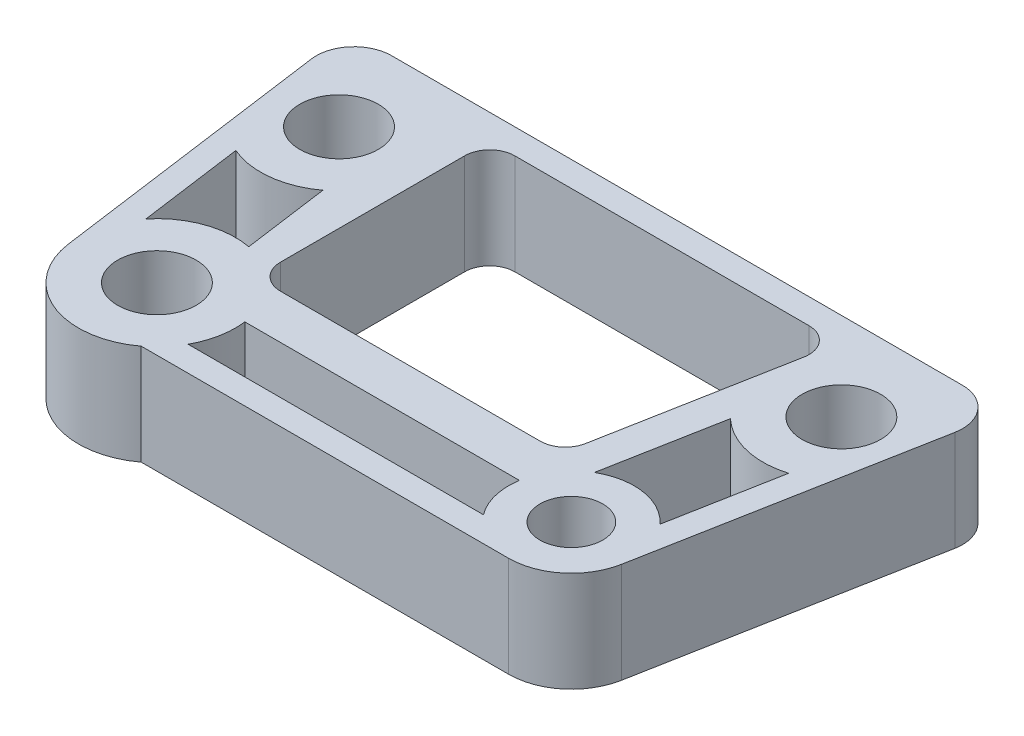
ISO-10303-21;
HEADER;
FILE_DESCRIPTION(('STEP AP214'),'2;1');
FILE_NAME('part.step','',(''),(''),'','','');
FILE_SCHEMA(('AUTOMOTIVE_DESIGN { 1 0 10303 214 1 1 1 1 }'));
ENDSEC;
DATA;
#1=APPLICATION_CONTEXT('core data for automotive mechanical design processes');
#2=APPLICATION_PROTOCOL_DEFINITION('international standard','automotive_design',2000,#1);
#3=PRODUCT_CONTEXT('',#1,'mechanical');
#4=PRODUCT('Part','Part','',(#3));
#5=PRODUCT_RELATED_PRODUCT_CATEGORY('part','',(#4));
#6=PRODUCT_DEFINITION_FORMATION('','',#4);
#7=PRODUCT_DEFINITION_CONTEXT('part definition',#1,'design');
#8=PRODUCT_DEFINITION('design','',#6,#7);
#9=PRODUCT_DEFINITION_SHAPE('','',#8);
#10=(LENGTH_UNIT() NAMED_UNIT(*) SI_UNIT(.MILLI.,.METRE.));
#11=(NAMED_UNIT(*) PLANE_ANGLE_UNIT() SI_UNIT($,.RADIAN.));
#12=(NAMED_UNIT(*) SI_UNIT($,.STERADIAN.) SOLID_ANGLE_UNIT());
#13=UNCERTAINTY_MEASURE_WITH_UNIT(LENGTH_MEASURE(1.E-05),#10,'distance_accuracy_value','');
#14=(GEOMETRIC_REPRESENTATION_CONTEXT(3) GLOBAL_UNCERTAINTY_ASSIGNED_CONTEXT((#13)) GLOBAL_UNIT_ASSIGNED_CONTEXT((#10,
#11,#12)) REPRESENTATION_CONTEXT('',''));
#15=CARTESIAN_POINT('',(0.,0.,0.));
#16=DIRECTION('',(0.,0.,1.));
#17=DIRECTION('',(1.,0.,0.));
#18=AXIS2_PLACEMENT_3D('',#15,#16,#17);
#19=CARTESIAN_POINT('',(0.,10.16,0.));
#20=DIRECTION('',(0.,1.,0.));
#21=DIRECTION('',(0.,0.,1.));
#22=AXIS2_PLACEMENT_3D('',#19,#20,#21);
#23=PLANE('',#22);
#24=DIRECTION('',(-1.,0.,0.));
#25=VECTOR('',#24,1.);
#26=CARTESIAN_POINT('',(36.7304782039458,10.16,-29.21));
#27=LINE('',#26,#25);
#28=CARTESIAN_POINT('',(36.7304782039458,10.16,-29.21));
#29=VERTEX_POINT('',#28);
#30=CARTESIAN_POINT('',(6.98499999999999,10.16,-29.21));
#31=VERTEX_POINT('',#30);
#32=EDGE_CURVE('E347',#29,#31,#27,.T.);
#33=ORIENTED_EDGE('',*,*,#32,.F.);
#34=CARTESIAN_POINT('',(36.7304782039458,10.16,-26.67));
#35=DIRECTION('',(0.,1.,0.));
#36=DIRECTION('',(0.,0.,-1.));
#37=AXIS2_PLACEMENT_3D('',#34,#35,#36);
#38=CIRCLE('',#37,2.54000000000001);
#39=CARTESIAN_POINT('',(39.2274023090102,10.16,-26.2041995990249));
#40=VERTEX_POINT('',#39);
#41=EDGE_CURVE('E345',#40,#29,#38,.T.);
#42=ORIENTED_EDGE('',*,*,#41,.F.);
#43=DIRECTION('',(0.183385984635866,0.,-0.983040986245809));
#44=VECTOR('',#43,1.);
#45=CARTESIAN_POINT('',(35.7526035417728,10.16,-7.5775329323582));
#46=LINE('',#45,#44);
#47=CARTESIAN_POINT('',(35.7526035417728,10.16,-7.5775329323582));
#48=VERTEX_POINT('',#47);
#49=EDGE_CURVE('E361',#48,#40,#46,.T.);
#50=ORIENTED_EDGE('',*,*,#49,.F.);
#51=CARTESIAN_POINT('',(33.2556794367085,10.16,-8.04333333333329));
#52=DIRECTION('',(0.,1.,0.));
#53=DIRECTION('',(0.,0.,1.));
#54=AXIS2_PLACEMENT_3D('',#51,#52,#53);
#55=CIRCLE('',#54,2.54);
#56=CARTESIAN_POINT('',(33.2556794367085,10.16,-5.50333333333329));
#57=VERTEX_POINT('',#56);
#58=EDGE_CURVE('E358',#57,#48,#55,.T.);
#59=ORIENTED_EDGE('',*,*,#58,.F.);
#60=DIRECTION('',(1.,0.,0.));
#61=VECTOR('',#60,1.);
#62=CARTESIAN_POINT('',(33.2556794367085,10.16,-5.50333333333329));
#63=LINE('',#62,#61);
#64=CARTESIAN_POINT('',(6.98499999999999,10.16,-5.50333333333328));
#65=VERTEX_POINT('',#64);
#66=EDGE_CURVE('E356',#65,#57,#63,.T.);
#67=ORIENTED_EDGE('',*,*,#66,.F.);
#68=CARTESIAN_POINT('',(6.98499999999999,10.16,-8.04333333333328));
#69=DIRECTION('',(0.,1.,0.));
#70=DIRECTION('',(0.,0.,1.));
#71=AXIS2_PLACEMENT_3D('',#68,#69,#70);
#72=CIRCLE('',#71,2.54);
#73=CARTESIAN_POINT('',(4.445,10.16,-8.04333333333328));
#74=VERTEX_POINT('',#73);
#75=EDGE_CURVE('E354',#74,#65,#72,.T.);
#76=ORIENTED_EDGE('',*,*,#75,.F.);
#77=DIRECTION('',(0.,0.,1.));
#78=VECTOR('',#77,1.);
#79=CARTESIAN_POINT('',(4.44499999999999,10.16,-26.6699999999999));
#80=LINE('',#79,#78);
#81=CARTESIAN_POINT('',(4.44499999999999,10.16,-26.6699999999999));
#82=VERTEX_POINT('',#81);
#83=EDGE_CURVE('E352',#82,#74,#80,.T.);
#84=ORIENTED_EDGE('',*,*,#83,.F.);
#85=CARTESIAN_POINT('',(6.98499999999999,10.16,-26.6699999999999));
#86=DIRECTION('',(0.,1.,0.));
#87=DIRECTION('',(0.,0.,-1.));
#88=AXIS2_PLACEMENT_3D('',#85,#86,#87);
#89=CIRCLE('',#88,2.54);
#90=EDGE_CURVE('E350',#31,#82,#89,.T.);
#91=ORIENTED_EDGE('',*,*,#90,.F.);
#92=EDGE_LOOP('',(#33,#42,#50,#59,#67,#76,#84,#91));
#93=FACE_BOUND('',#92,.T.);
#94=CARTESIAN_POINT('',(-4.445,10.16,-22.86));
#95=DIRECTION('',(0.,1.,0.));
#96=DIRECTION('',(0.,0.,1.));
#97=AXIS2_PLACEMENT_3D('',#94,#95,#96);
#98=CIRCLE('',#97,3.96875);
#99=CARTESIAN_POINT('',(-4.445,10.16,-18.89125));
#100=VERTEX_POINT('',#99);
#101=EDGE_CURVE('E404',#100,#100,#98,.T.);
#102=ORIENTED_EDGE('',*,*,#101,.F.);
#103=EDGE_LOOP('',(#102));
#104=FACE_BOUND('',#103,.T.);
#105=CARTESIAN_POINT('',(0.,10.16,0.));
#106=DIRECTION('',(0.,1.,0.));
#107=DIRECTION('',(0.,0.,1.));
#108=AXIS2_PLACEMENT_3D('',#105,#106,#107);
#109=CIRCLE('',#108,3.96875);
#110=CARTESIAN_POINT('',(0.,10.16,3.96875));
#111=VERTEX_POINT('',#110);
#112=EDGE_CURVE('E416',#111,#111,#109,.T.);
#113=ORIENTED_EDGE('',*,*,#112,.F.);
#114=EDGE_LOOP('',(#113));
#115=FACE_BOUND('',#114,.T.);
#116=DIRECTION('',(0.183385984635865,0.,-0.98304098624581));
#117=VECTOR('',#116,1.);
#118=CARTESIAN_POINT('',(48.1523102626609,10.16,1.16450100243773));
#119=LINE('',#118,#117);
#120=CARTESIAN_POINT('',(48.1523102626609,10.16,1.16450100243773));
#121=VERTEX_POINT('',#120);
#122=CARTESIAN_POINT('',(53.4514033307907,10.16,-27.2412993985373));
#123=VERTEX_POINT('',#122);
#124=EDGE_CURVE('E431',#121,#123,#119,.T.);
#125=ORIENTED_EDGE('',*,*,#124,.T.);
#126=CARTESIAN_POINT('',(49.7060171731942,10.16,-27.94));
#127=DIRECTION('',(0.,1.,0.));
#128=DIRECTION('',(0.,0.,1.));
#129=AXIS2_PLACEMENT_3D('',#126,#127,#128);
#130=CIRCLE('',#129,3.81);
#131=CARTESIAN_POINT('',(49.7060171731942,10.16,-31.75));
#132=VERTEX_POINT('',#131);
#133=EDGE_CURVE('E55',#123,#132,#130,.T.);
#134=ORIENTED_EDGE('',*,*,#133,.T.);
#135=DIRECTION('',(-1.,0.,0.));
#136=VECTOR('',#135,1.);
#137=CARTESIAN_POINT('',(54.2925,10.16,-31.75));
#138=LINE('',#137,#136);
#139=CARTESIAN_POINT('',(-8.01215852056534,10.16,-31.75));
#140=VERTEX_POINT('',#139);
#141=EDGE_CURVE('E433',#132,#140,#138,.T.);
#142=ORIENTED_EDGE('',*,*,#141,.T.);
#143=CARTESIAN_POINT('',(-8.01215852056534,10.16,-27.94));
#144=DIRECTION('',(0.,1.,0.));
#145=DIRECTION('',(0.,0.,1.));
#146=AXIS2_PLACEMENT_3D('',#143,#144,#145);
#147=CIRCLE('',#146,3.81);
#148=CARTESIAN_POINT('',(-11.786572069123,10.16,-27.4204787160625));
#149=VERTEX_POINT('',#148);
#150=EDGE_CURVE('E62',#140,#149,#147,.T.);
#151=ORIENTED_EDGE('',*,*,#150,.T.);
#152=DIRECTION('',(0.136357292372048,0.,0.990659724030892));
#153=VECTOR('',#152,1.);
#154=CARTESIAN_POINT('',(-12.3825,10.16,-31.75));
#155=LINE('',#154,#153);
#156=CARTESIAN_POINT('',(-7.86336155949521,10.16,1.08233600820313));
#157=VERTEX_POINT('',#156);
#158=EDGE_CURVE('E422',#149,#157,#155,.T.);
#159=ORIENTED_EDGE('',*,*,#158,.T.);
#160=CARTESIAN_POINT('',(0.,10.16,0.));
#161=DIRECTION('',(0.,1.,0.));
#162=DIRECTION('',(0.,0.,1.));
#163=AXIS2_PLACEMENT_3D('',#160,#161,#162);
#164=CIRCLE('',#163,7.9375);
#165=CARTESIAN_POINT('',(4.76250000000001,10.16,6.34999999999999));
#166=VERTEX_POINT('',#165);
#167=EDGE_CURVE('E424',#157,#166,#164,.T.);
#168=ORIENTED_EDGE('',*,*,#167,.T.);
#169=DIRECTION('',(1.,0.,0.));
#170=VECTOR('',#169,1.);
#171=CARTESIAN_POINT('',(41.91,10.16,6.34999999999999));
#172=LINE('',#171,#170);
#173=CARTESIAN_POINT('',(41.91,10.16,6.35));
#174=VERTEX_POINT('',#173);
#175=EDGE_CURVE('E427',#166,#174,#172,.T.);
#176=ORIENTED_EDGE('',*,*,#175,.T.);
#177=CARTESIAN_POINT('',(41.91,10.16,0.));
#178=DIRECTION('',(0.,1.,0.));
#179=DIRECTION('',(0.,0.,1.));
#180=AXIS2_PLACEMENT_3D('',#177,#178,#179);
#181=CIRCLE('',#180,6.35);
#182=EDGE_CURVE('E429',#174,#121,#181,.T.);
#183=ORIENTED_EDGE('',*,*,#182,.T.);
#184=EDGE_LOOP('',(#125,#134,#142,#151,#159,#168,#176,#183));
#185=FACE_BOUND('',#184,.T.);
#186=CARTESIAN_POINT('',(46.355,10.16,-22.86));
#187=DIRECTION('',(0.,1.,0.));
#188=DIRECTION('',(0.,0.,1.));
#189=AXIS2_PLACEMENT_3D('',#186,#187,#188);
#190=CIRCLE('',#189,3.96874999999998);
#191=CARTESIAN_POINT('',(46.355,10.16,-18.8912500000001));
#192=VERTEX_POINT('',#191);
#193=EDGE_CURVE('E410',#192,#192,#190,.T.);
#194=ORIENTED_EDGE('',*,*,#193,.F.);
#195=EDGE_LOOP('',(#194));
#196=FACE_BOUND('',#195,.T.);
#197=CARTESIAN_POINT('',(41.91,10.16,0.));
#198=DIRECTION('',(0.,1.,0.));
#199=DIRECTION('',(0.,0.,1.));
#200=AXIS2_PLACEMENT_3D('',#197,#198,#199);
#201=CIRCLE('',#200,3.175);
#202=CARTESIAN_POINT('',(41.91,10.16,3.175));
#203=VERTEX_POINT('',#202);
#204=EDGE_CURVE('E339',#203,#203,#201,.T.);
#205=ORIENTED_EDGE('',*,*,#204,.F.);
#206=EDGE_LOOP('',(#205));
#207=FACE_BOUND('',#206,.T.);
#208=DIRECTION('',(0.183385984635866,0.,-0.983040986245809));
#209=VECTOR('',#208,1.);
#210=CARTESIAN_POINT('',(46.5869869595467,10.16,-4.29514760866609));
#211=LINE('',#210,#209);
#212=CARTESIAN_POINT('',(46.5869869595467,10.16,-4.29514760866609));
#213=VERTEX_POINT('',#212);
#214=CARTESIAN_POINT('',(48.6317358483009,10.16,-15.2560286608206));
#215=VERTEX_POINT('',#214);
#216=EDGE_CURVE('E310',#213,#215,#211,.T.);
#217=ORIENTED_EDGE('',*,*,#216,.F.);
#218=CARTESIAN_POINT('',(41.91,10.16,0.));
#219=DIRECTION('',(0.,-1.,0.));
#220=DIRECTION('',(0.,0.,1.));
#221=AXIS2_PLACEMENT_3D('',#218,#219,#220);
#222=CIRCLE('',#221,6.35000000000001);
#223=CARTESIAN_POINT('',(38.7374424758988,10.16,-5.50067075512332));
#224=VERTEX_POINT('',#223);
#225=EDGE_CURVE('E308',#224,#213,#222,.T.);
#226=ORIENTED_EDGE('',*,*,#225,.F.);
#227=DIRECTION('',(-0.183385984635866,0.,0.983040986245809));
#228=VECTOR('',#227,1.);
#229=CARTESIAN_POINT('',(38.7374424758988,10.16,-5.50067075512332));
#230=LINE('',#229,#228);
#231=CARTESIAN_POINT('',(40.9001464947423,10.16,-17.0938505494414));
#232=VERTEX_POINT('',#231);
#233=EDGE_CURVE('E316',#232,#224,#230,.T.);
#234=ORIENTED_EDGE('',*,*,#233,.F.);
#235=CARTESIAN_POINT('',(46.355,10.16,-22.86));
#236=DIRECTION('',(0.,-1.,0.));
#237=DIRECTION('',(0.,0.,-1.));
#238=AXIS2_PLACEMENT_3D('',#235,#236,#237);
#239=CIRCLE('',#238,7.93750000000003);
#240=EDGE_CURVE('E313',#215,#232,#239,.T.);
#241=ORIENTED_EDGE('',*,*,#240,.F.);
#242=EDGE_LOOP('',(#217,#226,#234,#241));
#243=FACE_BOUND('',#242,.T.);
#244=DIRECTION('',(0.136357292372049,0.,0.990659724030892));
#245=VECTOR('',#244,1.);
#246=CARTESIAN_POINT('',(-6.14066773005149,10.16,-5.02952344453272));
#247=LINE('',#246,#245);
#248=CARTESIAN_POINT('',(-7.59189714293468,10.16,-15.5729605036209));
#249=VERTEX_POINT('',#248);
#250=CARTESIAN_POINT('',(-6.14066773005149,10.16,-5.02952344453272));
#251=VERTEX_POINT('',#250);
#252=EDGE_CURVE('E279',#249,#251,#247,.T.);
#253=ORIENTED_EDGE('',*,*,#252,.F.);
#254=CARTESIAN_POINT('',(-4.445,10.16,-22.86));
#255=DIRECTION('',(0.,-1.,0.));
#256=DIRECTION('',(0.,0.,1.));
#257=AXIS2_PLACEMENT_3D('',#254,#255,#256);
#258=CIRCLE('',#257,7.9375);
#259=CARTESIAN_POINT('',(0.293891224877469,10.16,-16.4923618029304));
#260=VERTEX_POINT('',#259);
#261=EDGE_CURVE('E277',#260,#249,#258,.T.);
#262=ORIENTED_EDGE('',*,*,#261,.F.);
#263=DIRECTION('',(-0.136357292372048,0.,-0.990659724030892));
#264=VECTOR('',#263,1.);
#265=CARTESIAN_POINT('',(1.49085157789414,10.16,-7.79623420778843));
#266=LINE('',#265,#264);
#267=CARTESIAN_POINT('',(1.49085157789414,10.16,-7.79623420778843));
#268=VERTEX_POINT('',#267);
#269=EDGE_CURVE('E285',#268,#260,#266,.T.);
#270=ORIENTED_EDGE('',*,*,#269,.F.);
#271=CARTESIAN_POINT('',(0.,10.16,0.));
#272=DIRECTION('',(0.,-1.,0.));
#273=DIRECTION('',(0.,0.,-1.));
#274=AXIS2_PLACEMENT_3D('',#271,#272,#273);
#275=CIRCLE('',#274,7.9375);
#276=EDGE_CURVE('E282',#251,#268,#275,.T.);
#277=ORIENTED_EDGE('',*,*,#276,.F.);
#278=EDGE_LOOP('',(#253,#262,#270,#277));
#279=FACE_BOUND('',#278,.T.);
#280=DIRECTION('',(-1.,0.,0.));
#281=VECTOR('',#280,1.);
#282=CARTESIAN_POINT('',(35.6418069589394,10.16,-1.01600000000001));
#283=LINE('',#282,#281);
#284=CARTESIAN_POINT('',(35.6418069589394,10.16,-1.01600000000001));
#285=VERTEX_POINT('',#284);
#286=CARTESIAN_POINT('',(7.87220745725111,10.16,-1.016));
#287=VERTEX_POINT('',#286);
#288=EDGE_CURVE('E246',#285,#287,#283,.T.);
#289=ORIENTED_EDGE('',*,*,#288,.F.);
#290=CARTESIAN_POINT('',(41.91,10.16,0.));
#291=DIRECTION('',(0.,-1.,0.));
#292=DIRECTION('',(0.,0.,-1.));
#293=AXIS2_PLACEMENT_3D('',#290,#291,#292);
#294=CIRCLE('',#293,6.34999999999999);
#295=CARTESIAN_POINT('',(36.83,10.16,3.80999999999999));
#296=VERTEX_POINT('',#295);
#297=EDGE_CURVE('E236',#296,#285,#294,.T.);
#298=ORIENTED_EDGE('',*,*,#297,.F.);
#299=DIRECTION('',(1.,0.,0.));
#300=VECTOR('',#299,1.);
#301=CARTESIAN_POINT('',(36.83,10.16,3.80999999999999));
#302=LINE('',#301,#300);
#303=CARTESIAN_POINT('',(6.96331862332897,10.16,3.80999999999999));
#304=VERTEX_POINT('',#303);
#305=EDGE_CURVE('E261',#304,#296,#302,.T.);
#306=ORIENTED_EDGE('',*,*,#305,.F.);
#307=CARTESIAN_POINT('',(0.,10.16,0.));
#308=DIRECTION('',(0.,-1.,0.));
#309=DIRECTION('',(0.,0.,1.));
#310=AXIS2_PLACEMENT_3D('',#307,#308,#309);
#311=CIRCLE('',#310,7.9375);
#312=EDGE_CURVE('E259',#287,#304,#311,.T.);
#313=ORIENTED_EDGE('',*,*,#312,.F.);
#314=EDGE_LOOP('',(#289,#298,#306,#313));
#315=FACE_BOUND('',#314,.T.);
#316=ADVANCED_FACE('F47',(#93,#104,#115,#185,#196,#207,#243,#279,#315),#23,.T.);
#317=CARTESIAN_POINT('',(0.,0.,0.));
#318=DIRECTION('',(0.,1.,0.));
#319=DIRECTION('',(0.,0.,1.));
#320=AXIS2_PLACEMENT_3D('',#317,#318,#319);
#321=PLANE('',#320);
#322=CARTESIAN_POINT('',(-4.445,0.,-22.86));
#323=DIRECTION('',(0.,-1.,0.));
#324=DIRECTION('',(0.,0.,1.));
#325=AXIS2_PLACEMENT_3D('',#322,#323,#324);
#326=CIRCLE('',#325,7.9375);
#327=CARTESIAN_POINT('',(0.293891224877469,0.,-16.4923618029304));
#328=VERTEX_POINT('',#327);
#329=CARTESIAN_POINT('',(-7.59189714293468,0.,-15.5729605036209));
#330=VERTEX_POINT('',#329);
#331=EDGE_CURVE('E254',#328,#330,#326,.T.);
#332=ORIENTED_EDGE('',*,*,#331,.T.);
#333=DIRECTION('',(0.136357292372049,0.,0.990659724030892));
#334=VECTOR('',#333,1.);
#335=CARTESIAN_POINT('',(-6.14066773005149,0.,-5.02952344453272));
#336=LINE('',#335,#334);
#337=CARTESIAN_POINT('',(-6.14066773005149,0.,-5.02952344453272));
#338=VERTEX_POINT('',#337);
#339=EDGE_CURVE('E290',#330,#338,#336,.T.);
#340=ORIENTED_EDGE('',*,*,#339,.T.);
#341=CARTESIAN_POINT('',(0.,0.,0.));
#342=DIRECTION('',(0.,-1.,0.));
#343=DIRECTION('',(0.,0.,-1.));
#344=AXIS2_PLACEMENT_3D('',#341,#342,#343);
#345=CIRCLE('',#344,7.9375);
#346=CARTESIAN_POINT('',(1.49085157789414,0.,-7.79623420778843));
#347=VERTEX_POINT('',#346);
#348=EDGE_CURVE('E293',#338,#347,#345,.T.);
#349=ORIENTED_EDGE('',*,*,#348,.T.);
#350=DIRECTION('',(-0.136357292372048,0.,-0.990659724030892));
#351=VECTOR('',#350,1.);
#352=CARTESIAN_POINT('',(1.49085157789414,0.,-7.79623420778843));
#353=LINE('',#352,#351);
#354=EDGE_CURVE('E280',#347,#328,#353,.T.);
#355=ORIENTED_EDGE('',*,*,#354,.T.);
#356=EDGE_LOOP('',(#332,#340,#349,#355));
#357=FACE_BOUND('',#356,.T.);
#358=CARTESIAN_POINT('',(41.91,0.,0.));
#359=DIRECTION('',(0.,1.,0.));
#360=DIRECTION('',(0.,0.,1.));
#361=AXIS2_PLACEMENT_3D('',#358,#359,#360);
#362=CIRCLE('',#361,3.175);
#363=CARTESIAN_POINT('',(41.91,0.,3.175));
#364=VERTEX_POINT('',#363);
#365=EDGE_CURVE('E338',#364,#364,#362,.T.);
#366=ORIENTED_EDGE('',*,*,#365,.T.);
#367=EDGE_LOOP('',(#366));
#368=FACE_BOUND('',#367,.T.);
#369=CARTESIAN_POINT('',(36.7304782039458,0.,-26.67));
#370=DIRECTION('',(0.,1.,0.));
#371=DIRECTION('',(0.,0.,-1.));
#372=AXIS2_PLACEMENT_3D('',#369,#370,#371);
#373=CIRCLE('',#372,2.54000000000001);
#374=CARTESIAN_POINT('',(39.2274023090102,0.,-26.2041995990249));
#375=VERTEX_POINT('',#374);
#376=CARTESIAN_POINT('',(36.7304782039458,0.,-29.21));
#377=VERTEX_POINT('',#376);
#378=EDGE_CURVE('E342',#375,#377,#373,.T.);
#379=ORIENTED_EDGE('',*,*,#378,.T.);
#380=DIRECTION('',(-1.,0.,0.));
#381=VECTOR('',#380,1.);
#382=CARTESIAN_POINT('',(36.7304782039458,0.,-29.21));
#383=LINE('',#382,#381);
#384=CARTESIAN_POINT('',(6.98499999999999,0.,-29.21));
#385=VERTEX_POINT('',#384);
#386=EDGE_CURVE('E366',#377,#385,#383,.T.);
#387=ORIENTED_EDGE('',*,*,#386,.T.);
#388=CARTESIAN_POINT('',(6.98499999999999,0.,-26.6699999999999));
#389=DIRECTION('',(0.,1.,0.));
#390=DIRECTION('',(0.,0.,-1.));
#391=AXIS2_PLACEMENT_3D('',#388,#389,#390);
#392=CIRCLE('',#391,2.54);
#393=CARTESIAN_POINT('',(4.44499999999999,0.,-26.6699999999999));
#394=VERTEX_POINT('',#393);
#395=EDGE_CURVE('E369',#385,#394,#392,.T.);
#396=ORIENTED_EDGE('',*,*,#395,.T.);
#397=DIRECTION('',(0.,0.,1.));
#398=VECTOR('',#397,1.);
#399=CARTESIAN_POINT('',(4.44499999999999,0.,-26.6699999999999));
#400=LINE('',#399,#398);
#401=CARTESIAN_POINT('',(4.445,0.,-8.04333333333328));
#402=VERTEX_POINT('',#401);
#403=EDGE_CURVE('E372',#394,#402,#400,.T.);
#404=ORIENTED_EDGE('',*,*,#403,.T.);
#405=CARTESIAN_POINT('',(6.98499999999999,0.,-8.04333333333328));
#406=DIRECTION('',(0.,1.,0.));
#407=DIRECTION('',(0.,0.,1.));
#408=AXIS2_PLACEMENT_3D('',#405,#406,#407);
#409=CIRCLE('',#408,2.54);
#410=CARTESIAN_POINT('',(6.98499999999999,0.,-5.50333333333328));
#411=VERTEX_POINT('',#410);
#412=EDGE_CURVE('E375',#402,#411,#409,.T.);
#413=ORIENTED_EDGE('',*,*,#412,.T.);
#414=DIRECTION('',(1.,0.,0.));
#415=VECTOR('',#414,1.);
#416=CARTESIAN_POINT('',(33.2556794367085,0.,-5.50333333333329));
#417=LINE('',#416,#415);
#418=CARTESIAN_POINT('',(33.2556794367085,0.,-5.50333333333329));
#419=VERTEX_POINT('',#418);
#420=EDGE_CURVE('E378',#411,#419,#417,.T.);
#421=ORIENTED_EDGE('',*,*,#420,.T.);
#422=CARTESIAN_POINT('',(33.2556794367085,0.,-8.04333333333329));
#423=DIRECTION('',(0.,1.,0.));
#424=DIRECTION('',(0.,0.,1.));
#425=AXIS2_PLACEMENT_3D('',#422,#423,#424);
#426=CIRCLE('',#425,2.54);
#427=CARTESIAN_POINT('',(35.7526035417729,0.,-7.5775329323582));
#428=VERTEX_POINT('',#427);
#429=EDGE_CURVE('E381',#419,#428,#426,.T.);
#430=ORIENTED_EDGE('',*,*,#429,.T.);
#431=DIRECTION('',(0.183385984635866,0.,-0.983040986245809));
#432=VECTOR('',#431,1.);
#433=CARTESIAN_POINT('',(35.7526035417728,0.,-7.5775329323582));
#434=LINE('',#433,#432);
#435=EDGE_CURVE('E348',#428,#375,#434,.T.);
#436=ORIENTED_EDGE('',*,*,#435,.T.);
#437=EDGE_LOOP('',(#379,#387,#396,#404,#413,#421,#430,#436));
#438=FACE_BOUND('',#437,.T.);
#439=DIRECTION('',(-1.,0.,0.));
#440=VECTOR('',#439,1.);
#441=CARTESIAN_POINT('',(54.2925,0.,-31.75));
#442=LINE('',#441,#440);
#443=CARTESIAN_POINT('',(49.7060171731942,0.,-31.75));
#444=VERTEX_POINT('',#443);
#445=CARTESIAN_POINT('',(-8.01215852056534,0.,-31.75));
#446=VERTEX_POINT('',#445);
#447=EDGE_CURVE('E425',#444,#446,#442,.T.);
#448=ORIENTED_EDGE('',*,*,#447,.F.);
#449=CARTESIAN_POINT('',(49.7060171731942,0.,-27.94));
#450=DIRECTION('',(0.,1.,0.));
#451=DIRECTION('',(0.,0.,1.));
#452=AXIS2_PLACEMENT_3D('',#449,#450,#451);
#453=CIRCLE('',#452,3.81);
#454=CARTESIAN_POINT('',(53.4514033307907,0.,-27.2412993985373));
#455=VERTEX_POINT('',#454);
#456=EDGE_CURVE('E465',#444,#455,#453,.F.);
#457=ORIENTED_EDGE('',*,*,#456,.T.);
#458=DIRECTION('',(0.183385984635865,0.,-0.98304098624581));
#459=VECTOR('',#458,1.);
#460=CARTESIAN_POINT('',(48.1523102626609,0.,1.16450100243773));
#461=LINE('',#460,#459);
#462=CARTESIAN_POINT('',(48.1523102626609,0.,1.16450100243773));
#463=VERTEX_POINT('',#462);
#464=EDGE_CURVE('E443',#463,#455,#461,.T.);
#465=ORIENTED_EDGE('',*,*,#464,.F.);
#466=CARTESIAN_POINT('',(41.91,0.,0.));
#467=DIRECTION('',(0.,1.,0.));
#468=DIRECTION('',(0.,0.,1.));
#469=AXIS2_PLACEMENT_3D('',#466,#467,#468);
#470=CIRCLE('',#469,6.35);
#471=CARTESIAN_POINT('',(41.91,0.,6.35));
#472=VERTEX_POINT('',#471);
#473=EDGE_CURVE('E441',#472,#463,#470,.T.);
#474=ORIENTED_EDGE('',*,*,#473,.F.);
#475=DIRECTION('',(1.,0.,0.));
#476=VECTOR('',#475,1.);
#477=CARTESIAN_POINT('',(41.91,0.,6.34999999999999));
#478=LINE('',#477,#476);
#479=CARTESIAN_POINT('',(4.76250000000001,0.,6.34999999999999));
#480=VERTEX_POINT('',#479);
#481=EDGE_CURVE('E439',#480,#472,#478,.T.);
#482=ORIENTED_EDGE('',*,*,#481,.F.);
#483=CARTESIAN_POINT('',(0.,0.,0.));
#484=DIRECTION('',(0.,1.,0.));
#485=DIRECTION('',(0.,0.,1.));
#486=AXIS2_PLACEMENT_3D('',#483,#484,#485);
#487=CIRCLE('',#486,7.9375);
#488=CARTESIAN_POINT('',(-7.86336155949521,0.,1.08233600820313));
#489=VERTEX_POINT('',#488);
#490=EDGE_CURVE('E437',#489,#480,#487,.T.);
#491=ORIENTED_EDGE('',*,*,#490,.F.);
#492=DIRECTION('',(0.136357292372048,0.,0.990659724030892));
#493=VECTOR('',#492,1.);
#494=CARTESIAN_POINT('',(-12.3825,0.,-31.75));
#495=LINE('',#494,#493);
#496=CARTESIAN_POINT('',(-11.786572069123,0.,-27.4204787160625));
#497=VERTEX_POINT('',#496);
#498=EDGE_CURVE('E419',#497,#489,#495,.T.);
#499=ORIENTED_EDGE('',*,*,#498,.F.);
#500=CARTESIAN_POINT('',(-8.01215852056534,0.,-27.94));
#501=DIRECTION('',(0.,1.,0.));
#502=DIRECTION('',(0.,0.,1.));
#503=AXIS2_PLACEMENT_3D('',#500,#501,#502);
#504=CIRCLE('',#503,3.81);
#505=EDGE_CURVE('E463',#497,#446,#504,.F.);
#506=ORIENTED_EDGE('',*,*,#505,.T.);
#507=EDGE_LOOP('',(#448,#457,#465,#474,#482,#491,#499,#506));
#508=FACE_BOUND('',#507,.T.);
#509=CARTESIAN_POINT('',(0.,0.,0.));
#510=DIRECTION('',(0.,1.,0.));
#511=DIRECTION('',(0.,0.,1.));
#512=AXIS2_PLACEMENT_3D('',#509,#510,#511);
#513=CIRCLE('',#512,3.96875);
#514=CARTESIAN_POINT('',(0.,0.,3.96875));
#515=VERTEX_POINT('',#514);
#516=EDGE_CURVE('E413',#515,#515,#513,.T.);
#517=ORIENTED_EDGE('',*,*,#516,.T.);
#518=EDGE_LOOP('',(#517));
#519=FACE_BOUND('',#518,.T.);
#520=CARTESIAN_POINT('',(46.355,0.,-22.86));
#521=DIRECTION('',(0.,1.,0.));
#522=DIRECTION('',(0.,0.,1.));
#523=AXIS2_PLACEMENT_3D('',#520,#521,#522);
#524=CIRCLE('',#523,3.96874999999998);
#525=CARTESIAN_POINT('',(46.355,0.,-18.8912500000001));
#526=VERTEX_POINT('',#525);
#527=EDGE_CURVE('E407',#526,#526,#524,.T.);
#528=ORIENTED_EDGE('',*,*,#527,.T.);
#529=EDGE_LOOP('',(#528));
#530=FACE_BOUND('',#529,.T.);
#531=CARTESIAN_POINT('',(-4.445,0.,-22.86));
#532=DIRECTION('',(0.,1.,0.));
#533=DIRECTION('',(0.,0.,1.));
#534=AXIS2_PLACEMENT_3D('',#531,#532,#533);
#535=CIRCLE('',#534,3.96875);
#536=CARTESIAN_POINT('',(-4.445,0.,-18.89125));
#537=VERTEX_POINT('',#536);
#538=EDGE_CURVE('E403',#537,#537,#535,.T.);
#539=ORIENTED_EDGE('',*,*,#538,.T.);
#540=EDGE_LOOP('',(#539));
#541=FACE_BOUND('',#540,.T.);
#542=CARTESIAN_POINT('',(41.91,0.,0.));
#543=DIRECTION('',(0.,-1.,0.));
#544=DIRECTION('',(0.,0.,1.));
#545=AXIS2_PLACEMENT_3D('',#542,#543,#544);
#546=CIRCLE('',#545,6.35000000000001);
#547=CARTESIAN_POINT('',(38.7374424758988,0.,-5.50067075512332));
#548=VERTEX_POINT('',#547);
#549=CARTESIAN_POINT('',(46.5869869595467,0.,-4.29514760866609));
#550=VERTEX_POINT('',#549);
#551=EDGE_CURVE('E307',#548,#550,#546,.T.);
#552=ORIENTED_EDGE('',*,*,#551,.T.);
#553=DIRECTION('',(0.183385984635866,0.,-0.983040986245809));
#554=VECTOR('',#553,1.);
#555=CARTESIAN_POINT('',(46.5869869595467,0.,-4.29514760866609));
#556=LINE('',#555,#554);
#557=CARTESIAN_POINT('',(48.6317358483009,0.,-15.2560286608206));
#558=VERTEX_POINT('',#557);
#559=EDGE_CURVE('E321',#550,#558,#556,.T.);
#560=ORIENTED_EDGE('',*,*,#559,.T.);
#561=CARTESIAN_POINT('',(46.355,0.,-22.86));
#562=DIRECTION('',(0.,-1.,0.));
#563=DIRECTION('',(0.,0.,-1.));
#564=AXIS2_PLACEMENT_3D('',#561,#562,#563);
#565=CIRCLE('',#564,7.93750000000003);
#566=CARTESIAN_POINT('',(40.9001464947422,0.,-17.0938505494414));
#567=VERTEX_POINT('',#566);
#568=EDGE_CURVE('E324',#558,#567,#565,.T.);
#569=ORIENTED_EDGE('',*,*,#568,.T.);
#570=DIRECTION('',(-0.183385984635866,0.,0.983040986245809));
#571=VECTOR('',#570,1.);
#572=CARTESIAN_POINT('',(38.7374424758988,0.,-5.50067075512332));
#573=LINE('',#572,#571);
#574=EDGE_CURVE('E311',#567,#548,#573,.T.);
#575=ORIENTED_EDGE('',*,*,#574,.T.);
#576=EDGE_LOOP('',(#552,#560,#569,#575));
#577=FACE_BOUND('',#576,.T.);
#578=CARTESIAN_POINT('',(41.91,0.,0.));
#579=DIRECTION('',(0.,-1.,0.));
#580=DIRECTION('',(0.,0.,-1.));
#581=AXIS2_PLACEMENT_3D('',#578,#579,#580);
#582=CIRCLE('',#581,6.34999999999999);
#583=CARTESIAN_POINT('',(36.83,0.,3.80999999999999));
#584=VERTEX_POINT('',#583);
#585=CARTESIAN_POINT('',(35.6418069589394,0.,-1.01600000000001));
#586=VERTEX_POINT('',#585);
#587=EDGE_CURVE('E265',#584,#586,#582,.T.);
#588=ORIENTED_EDGE('',*,*,#587,.T.);
#589=DIRECTION('',(-1.,0.,0.));
#590=VECTOR('',#589,1.);
#591=CARTESIAN_POINT('',(35.6418069589394,0.,-1.01600000000001));
#592=LINE('',#591,#590);
#593=CARTESIAN_POINT('',(7.87220745725111,0.,-1.016));
#594=VERTEX_POINT('',#593);
#595=EDGE_CURVE('E253',#586,#594,#592,.T.);
#596=ORIENTED_EDGE('',*,*,#595,.T.);
#597=CARTESIAN_POINT('',(0.,0.,0.));
#598=DIRECTION('',(0.,-1.,0.));
#599=DIRECTION('',(0.,0.,1.));
#600=AXIS2_PLACEMENT_3D('',#597,#598,#599);
#601=CIRCLE('',#600,7.9375);
#602=CARTESIAN_POINT('',(6.96331862332897,0.,3.80999999999999));
#603=VERTEX_POINT('',#602);
#604=EDGE_CURVE('E268',#594,#603,#601,.T.);
#605=ORIENTED_EDGE('',*,*,#604,.T.);
#606=DIRECTION('',(1.,0.,0.));
#607=VECTOR('',#606,1.);
#608=CARTESIAN_POINT('',(36.83,0.,3.80999999999999));
#609=LINE('',#608,#607);
#610=EDGE_CURVE('E247',#603,#584,#609,.T.);
#611=ORIENTED_EDGE('',*,*,#610,.T.);
#612=EDGE_LOOP('',(#588,#596,#605,#611));
#613=FACE_BOUND('',#612,.T.);
#614=ADVANCED_FACE('F480',(#357,#368,#438,#508,#519,#530,#541,#577,#613),#321,.F.);
#615=CARTESIAN_POINT('',(-12.3825,10.16,-31.75));
#616=DIRECTION('',(0.990659724030892,0.,-0.136357292372048));
#617=DIRECTION('',(-0.136357292372048,0.,-0.990659724030892));
#618=AXIS2_PLACEMENT_3D('',#615,#616,#617);
#619=PLANE('',#618);
#620=ORIENTED_EDGE('',*,*,#158,.F.);
#621=DIRECTION('',(0.,-1.,0.));
#622=VECTOR('',#621,1.);
#623=CARTESIAN_POINT('',(-11.786572069123,10.16,-27.4204787160624));
#624=LINE('',#623,#622);
#625=EDGE_CURVE('E11',#149,#497,#624,.T.);
#626=ORIENTED_EDGE('',*,*,#625,.T.);
#627=ORIENTED_EDGE('',*,*,#498,.T.);
#628=DIRECTION('',(0.,-1.,0.));
#629=VECTOR('',#628,1.);
#630=CARTESIAN_POINT('',(-7.86336155949521,10.16,1.08233600820313));
#631=LINE('',#630,#629);
#632=EDGE_CURVE('E455',#157,#489,#631,.T.);
#633=ORIENTED_EDGE('',*,*,#632,.F.);
#634=EDGE_LOOP('',(#620,#626,#627,#633));
#635=FACE_BOUND('',#634,.T.);
#636=ADVANCED_FACE('F501',(#635),#619,.F.);
#637=CARTESIAN_POINT('',(0.,10.16,0.));
#638=DIRECTION('',(0.,-1.,0.));
#639=DIRECTION('',(0.,0.,-1.));
#640=AXIS2_PLACEMENT_3D('',#637,#638,#639);
#641=CYLINDRICAL_SURFACE('',#640,7.9375);
#642=ORIENTED_EDGE('',*,*,#490,.T.);
#643=DIRECTION('',(0.,-1.,0.));
#644=VECTOR('',#643,1.);
#645=CARTESIAN_POINT('',(4.76250000000001,10.16,6.34999999999999));
#646=LINE('',#645,#644);
#647=EDGE_CURVE('E452',#166,#480,#646,.T.);
#648=ORIENTED_EDGE('',*,*,#647,.F.);
#649=ORIENTED_EDGE('',*,*,#167,.F.);
#650=ORIENTED_EDGE('',*,*,#632,.T.);
#651=EDGE_LOOP('',(#642,#648,#649,#650));
#652=FACE_BOUND('',#651,.T.);
#653=ADVANCED_FACE('F498',(#652),#641,.T.);
#654=CARTESIAN_POINT('',(41.91,10.16,6.34999999999999));
#655=DIRECTION('',(0.,0.,-1.));
#656=DIRECTION('',(-1.,0.,0.));
#657=AXIS2_PLACEMENT_3D('',#654,#655,#656);
#658=PLANE('',#657);
#659=ORIENTED_EDGE('',*,*,#481,.T.);
#660=DIRECTION('',(0.,-1.,0.));
#661=VECTOR('',#660,1.);
#662=CARTESIAN_POINT('',(41.91,10.16,6.35));
#663=LINE('',#662,#661);
#664=EDGE_CURVE('E449',#174,#472,#663,.T.);
#665=ORIENTED_EDGE('',*,*,#664,.F.);
#666=ORIENTED_EDGE('',*,*,#175,.F.);
#667=ORIENTED_EDGE('',*,*,#647,.T.);
#668=EDGE_LOOP('',(#659,#665,#666,#667));
#669=FACE_BOUND('',#668,.T.);
#670=ADVANCED_FACE('F493',(#669),#658,.F.);
#671=CARTESIAN_POINT('',(41.91,10.16,0.));
#672=DIRECTION('',(0.,-1.,0.));
#673=DIRECTION('',(0.,0.,-1.));
#674=AXIS2_PLACEMENT_3D('',#671,#672,#673);
#675=CYLINDRICAL_SURFACE('',#674,6.35);
#676=ORIENTED_EDGE('',*,*,#473,.T.);
#677=DIRECTION('',(0.,-1.,0.));
#678=VECTOR('',#677,1.);
#679=CARTESIAN_POINT('',(48.1523102626609,10.16,1.16450100243773));
#680=LINE('',#679,#678);
#681=EDGE_CURVE('E435',#121,#463,#680,.T.);
#682=ORIENTED_EDGE('',*,*,#681,.F.);
#683=ORIENTED_EDGE('',*,*,#182,.F.);
#684=ORIENTED_EDGE('',*,*,#664,.T.);
#685=EDGE_LOOP('',(#676,#682,#683,#684));
#686=FACE_BOUND('',#685,.T.);
#687=ADVANCED_FACE('F487',(#686),#675,.T.);
#688=CARTESIAN_POINT('',(48.1523102626609,10.16,1.16450100243773));
#689=DIRECTION('',(-0.98304098624581,0.,-0.183385984635865));
#690=DIRECTION('',(-0.183385984635866,0.,0.98304098624581));
#691=AXIS2_PLACEMENT_3D('',#688,#689,#690);
#692=PLANE('',#691);
#693=ORIENTED_EDGE('',*,*,#464,.T.);
#694=DIRECTION('',(0.,-1.,0.));
#695=VECTOR('',#694,1.);
#696=CARTESIAN_POINT('',(53.4514033307907,10.16,-27.2412993985373));
#697=LINE('',#696,#695);
#698=EDGE_CURVE('E70',#455,#123,#697,.F.);
#699=ORIENTED_EDGE('',*,*,#698,.T.);
#700=ORIENTED_EDGE('',*,*,#124,.F.);
#701=ORIENTED_EDGE('',*,*,#681,.T.);
#702=EDGE_LOOP('',(#693,#699,#700,#701));
#703=FACE_BOUND('',#702,.T.);
#704=ADVANCED_FACE('F483',(#703),#692,.F.);
#705=CARTESIAN_POINT('',(54.2925,10.16,-31.75));
#706=DIRECTION('',(0.,0.,1.));
#707=DIRECTION('',(1.,0.,0.));
#708=AXIS2_PLACEMENT_3D('',#705,#706,#707);
#709=PLANE('',#708);
#710=ORIENTED_EDGE('',*,*,#141,.F.);
#711=DIRECTION('',(0.,-1.,0.));
#712=VECTOR('',#711,1.);
#713=CARTESIAN_POINT('',(49.7060171731942,10.16,-31.75));
#714=LINE('',#713,#712);
#715=EDGE_CURVE('E460',#132,#444,#714,.T.);
#716=ORIENTED_EDGE('',*,*,#715,.T.);
#717=ORIENTED_EDGE('',*,*,#447,.T.);
#718=DIRECTION('',(0.,-1.,0.));
#719=VECTOR('',#718,1.);
#720=CARTESIAN_POINT('',(-8.01215852056534,10.16,-31.75));
#721=LINE('',#720,#719);
#722=EDGE_CURVE('E458',#446,#140,#721,.F.);
#723=ORIENTED_EDGE('',*,*,#722,.T.);
#724=EDGE_LOOP('',(#710,#716,#717,#723));
#725=FACE_BOUND('',#724,.T.);
#726=ADVANCED_FACE('F474',(#725),#709,.F.);
#727=CARTESIAN_POINT('',(0.,10.16,0.));
#728=DIRECTION('',(0.,-1.,0.));
#729=DIRECTION('',(0.,0.,-1.));
#730=AXIS2_PLACEMENT_3D('',#727,#728,#729);
#731=CYLINDRICAL_SURFACE('',#730,3.96875);
#732=ORIENTED_EDGE('',*,*,#112,.T.);
#733=EDGE_LOOP('',(#732));
#734=FACE_BOUND('',#733,.T.);
#735=ORIENTED_EDGE('',*,*,#516,.F.);
#736=EDGE_LOOP('',(#735));
#737=FACE_BOUND('',#736,.T.);
#738=ADVANCED_FACE('F521',(#734,#737),#731,.F.);
#739=CARTESIAN_POINT('',(46.355,10.16,-22.86));
#740=DIRECTION('',(0.,-1.,0.));
#741=DIRECTION('',(0.,0.,-1.));
#742=AXIS2_PLACEMENT_3D('',#739,#740,#741);
#743=CYLINDRICAL_SURFACE('',#742,3.96874999999998);
#744=ORIENTED_EDGE('',*,*,#193,.T.);
#745=EDGE_LOOP('',(#744));
#746=FACE_BOUND('',#745,.T.);
#747=ORIENTED_EDGE('',*,*,#527,.F.);
#748=EDGE_LOOP('',(#747));
#749=FACE_BOUND('',#748,.T.);
#750=ADVANCED_FACE('F778',(#746,#749),#743,.F.);
#751=CARTESIAN_POINT('',(-4.445,10.16,-22.86));
#752=DIRECTION('',(0.,-1.,0.));
#753=DIRECTION('',(0.,0.,-1.));
#754=AXIS2_PLACEMENT_3D('',#751,#752,#753);
#755=CYLINDRICAL_SURFACE('',#754,3.96875);
#756=ORIENTED_EDGE('',*,*,#101,.T.);
#757=EDGE_LOOP('',(#756));
#758=FACE_BOUND('',#757,.T.);
#759=ORIENTED_EDGE('',*,*,#538,.F.);
#760=EDGE_LOOP('',(#759));
#761=FACE_BOUND('',#760,.T.);
#762=ADVANCED_FACE('F767',(#758,#761),#755,.F.);
#763=CARTESIAN_POINT('',(36.7304782039458,10.16,-26.67));
#764=DIRECTION('',(0.,-1.,0.));
#765=DIRECTION('',(0.,0.,-1.));
#766=AXIS2_PLACEMENT_3D('',#763,#764,#765);
#767=CYLINDRICAL_SURFACE('',#766,2.54000000000001);
#768=ORIENTED_EDGE('',*,*,#378,.F.);
#769=DIRECTION('',(0.,-1.,0.));
#770=VECTOR('',#769,1.);
#771=CARTESIAN_POINT('',(39.2274023090102,10.16,-26.2041995990249));
#772=LINE('',#771,#770);
#773=EDGE_CURVE('E363',#40,#375,#772,.T.);
#774=ORIENTED_EDGE('',*,*,#773,.F.);
#775=ORIENTED_EDGE('',*,*,#41,.T.);
#776=DIRECTION('',(0.,-1.,0.));
#777=VECTOR('',#776,1.);
#778=CARTESIAN_POINT('',(36.7304782039458,10.16,-29.21));
#779=LINE('',#778,#777);
#780=EDGE_CURVE('E400',#29,#377,#779,.T.);
#781=ORIENTED_EDGE('',*,*,#780,.T.);
#782=EDGE_LOOP('',(#768,#774,#775,#781));
#783=FACE_BOUND('',#782,.T.);
#784=ADVANCED_FACE('F757',(#783),#767,.F.);
#785=CARTESIAN_POINT('',(36.7304782039458,10.16,-29.21));
#786=DIRECTION('',(0.,0.,1.));
#787=DIRECTION('',(1.,0.,0.));
#788=AXIS2_PLACEMENT_3D('',#785,#786,#787);
#789=PLANE('',#788);
#790=ORIENTED_EDGE('',*,*,#386,.F.);
#791=ORIENTED_EDGE('',*,*,#780,.F.);
#792=ORIENTED_EDGE('',*,*,#32,.T.);
#793=DIRECTION('',(0.,-1.,0.));
#794=VECTOR('',#793,1.);
#795=CARTESIAN_POINT('',(6.98499999999999,10.16,-29.21));
#796=LINE('',#795,#794);
#797=EDGE_CURVE('E398',#31,#385,#796,.T.);
#798=ORIENTED_EDGE('',*,*,#797,.T.);
#799=EDGE_LOOP('',(#790,#791,#792,#798));
#800=FACE_BOUND('',#799,.T.);
#801=ADVANCED_FACE('F747',(#800),#789,.T.);
#802=CARTESIAN_POINT('',(6.98499999999999,10.16,-26.6699999999999));
#803=DIRECTION('',(0.,-1.,0.));
#804=DIRECTION('',(0.,0.,-1.));
#805=AXIS2_PLACEMENT_3D('',#802,#803,#804);
#806=CYLINDRICAL_SURFACE('',#805,2.54);
#807=ORIENTED_EDGE('',*,*,#395,.F.);
#808=ORIENTED_EDGE('',*,*,#797,.F.);
#809=ORIENTED_EDGE('',*,*,#90,.T.);
#810=DIRECTION('',(0.,-1.,0.));
#811=VECTOR('',#810,1.);
#812=CARTESIAN_POINT('',(4.44499999999999,10.16,-26.6699999999999));
#813=LINE('',#812,#811);
#814=EDGE_CURVE('E396',#82,#394,#813,.T.);
#815=ORIENTED_EDGE('',*,*,#814,.T.);
#816=EDGE_LOOP('',(#807,#808,#809,#815));
#817=FACE_BOUND('',#816,.T.);
#818=ADVANCED_FACE('F737',(#817),#806,.F.);
#819=CARTESIAN_POINT('',(4.44499999999999,10.16,-26.6699999999999));
#820=DIRECTION('',(1.,0.,0.));
#821=DIRECTION('',(0.,0.,-1.));
#822=AXIS2_PLACEMENT_3D('',#819,#820,#821);
#823=PLANE('',#822);
#824=ORIENTED_EDGE('',*,*,#403,.F.);
#825=ORIENTED_EDGE('',*,*,#814,.F.);
#826=ORIENTED_EDGE('',*,*,#83,.T.);
#827=DIRECTION('',(0.,-1.,0.));
#828=VECTOR('',#827,1.);
#829=CARTESIAN_POINT('',(4.445,10.16,-8.04333333333328));
#830=LINE('',#829,#828);
#831=EDGE_CURVE('E394',#74,#402,#830,.T.);
#832=ORIENTED_EDGE('',*,*,#831,.T.);
#833=EDGE_LOOP('',(#824,#825,#826,#832));
#834=FACE_BOUND('',#833,.T.);
#835=ADVANCED_FACE('F727',(#834),#823,.T.);
#836=CARTESIAN_POINT('',(6.98499999999999,10.16,-8.04333333333328));
#837=DIRECTION('',(0.,-1.,0.));
#838=DIRECTION('',(0.,0.,-1.));
#839=AXIS2_PLACEMENT_3D('',#836,#837,#838);
#840=CYLINDRICAL_SURFACE('',#839,2.54);
#841=ORIENTED_EDGE('',*,*,#412,.F.);
#842=ORIENTED_EDGE('',*,*,#831,.F.);
#843=ORIENTED_EDGE('',*,*,#75,.T.);
#844=DIRECTION('',(0.,-1.,0.));
#845=VECTOR('',#844,1.);
#846=CARTESIAN_POINT('',(6.98499999999999,10.16,-5.50333333333328));
#847=LINE('',#846,#845);
#848=EDGE_CURVE('E392',#65,#411,#847,.T.);
#849=ORIENTED_EDGE('',*,*,#848,.T.);
#850=EDGE_LOOP('',(#841,#842,#843,#849));
#851=FACE_BOUND('',#850,.T.);
#852=ADVANCED_FACE('F717',(#851),#840,.F.);
#853=CARTESIAN_POINT('',(33.2556794367085,10.16,-5.50333333333329));
#854=DIRECTION('',(0.,0.,-1.));
#855=DIRECTION('',(-1.,0.,0.));
#856=AXIS2_PLACEMENT_3D('',#853,#854,#855);
#857=PLANE('',#856);
#858=ORIENTED_EDGE('',*,*,#420,.F.);
#859=ORIENTED_EDGE('',*,*,#848,.F.);
#860=ORIENTED_EDGE('',*,*,#66,.T.);
#861=DIRECTION('',(0.,-1.,0.));
#862=VECTOR('',#861,1.);
#863=CARTESIAN_POINT('',(33.2556794367085,10.16,-5.50333333333329));
#864=LINE('',#863,#862);
#865=EDGE_CURVE('E390',#57,#419,#864,.T.);
#866=ORIENTED_EDGE('',*,*,#865,.T.);
#867=EDGE_LOOP('',(#858,#859,#860,#866));
#868=FACE_BOUND('',#867,.T.);
#869=ADVANCED_FACE('F707',(#868),#857,.T.);
#870=CARTESIAN_POINT('',(33.2556794367085,10.16,-8.04333333333329));
#871=DIRECTION('',(0.,-1.,0.));
#872=DIRECTION('',(0.,0.,-1.));
#873=AXIS2_PLACEMENT_3D('',#870,#871,#872);
#874=CYLINDRICAL_SURFACE('',#873,2.54);
#875=ORIENTED_EDGE('',*,*,#429,.F.);
#876=ORIENTED_EDGE('',*,*,#865,.F.);
#877=ORIENTED_EDGE('',*,*,#58,.T.);
#878=DIRECTION('',(0.,-1.,0.));
#879=VECTOR('',#878,1.);
#880=CARTESIAN_POINT('',(35.7526035417729,10.16,-7.5775329323582));
#881=LINE('',#880,#879);
#882=EDGE_CURVE('E388',#48,#428,#881,.T.);
#883=ORIENTED_EDGE('',*,*,#882,.T.);
#884=EDGE_LOOP('',(#875,#876,#877,#883));
#885=FACE_BOUND('',#884,.T.);
#886=ADVANCED_FACE('F697',(#885),#874,.F.);
#887=CARTESIAN_POINT('',(35.7526035417728,10.16,-7.5775329323582));
#888=DIRECTION('',(-0.983040986245809,0.,-0.183385984635866));
#889=DIRECTION('',(-0.183385984635866,0.,0.983040986245809));
#890=AXIS2_PLACEMENT_3D('',#887,#888,#889);
#891=PLANE('',#890);
#892=ORIENTED_EDGE('',*,*,#435,.F.);
#893=ORIENTED_EDGE('',*,*,#882,.F.);
#894=ORIENTED_EDGE('',*,*,#49,.T.);
#895=ORIENTED_EDGE('',*,*,#773,.T.);
#896=EDGE_LOOP('',(#892,#893,#894,#895));
#897=FACE_BOUND('',#896,.T.);
#898=ADVANCED_FACE('F687',(#897),#891,.T.);
#899=CARTESIAN_POINT('',(41.91,10.16,0.));
#900=DIRECTION('',(0.,-1.,0.));
#901=DIRECTION('',(0.,0.,-1.));
#902=AXIS2_PLACEMENT_3D('',#899,#900,#901);
#903=CYLINDRICAL_SURFACE('',#902,3.175);
#904=ORIENTED_EDGE('',*,*,#204,.T.);
#905=EDGE_LOOP('',(#904));
#906=FACE_BOUND('',#905,.T.);
#907=ORIENTED_EDGE('',*,*,#365,.F.);
#908=EDGE_LOOP('',(#907));
#909=FACE_BOUND('',#908,.T.);
#910=ADVANCED_FACE('F676',(#906,#909),#903,.F.);
#911=CARTESIAN_POINT('',(41.91,10.16,0.));
#912=DIRECTION('',(0.,-1.,0.));
#913=DIRECTION('',(0.,0.,-1.));
#914=AXIS2_PLACEMENT_3D('',#911,#912,#913);
#915=CYLINDRICAL_SURFACE('',#914,6.35000000000001);
#916=ORIENTED_EDGE('',*,*,#551,.F.);
#917=DIRECTION('',(0.,-1.,0.));
#918=VECTOR('',#917,1.);
#919=CARTESIAN_POINT('',(38.7374424758988,10.16,-5.50067075512332));
#920=LINE('',#919,#918);
#921=EDGE_CURVE('E318',#224,#548,#920,.T.);
#922=ORIENTED_EDGE('',*,*,#921,.F.);
#923=ORIENTED_EDGE('',*,*,#225,.T.);
#924=DIRECTION('',(0.,-1.,0.));
#925=VECTOR('',#924,1.);
#926=CARTESIAN_POINT('',(46.5869869595467,10.16,-4.29514760866609));
#927=LINE('',#926,#925);
#928=EDGE_CURVE('E335',#213,#550,#927,.T.);
#929=ORIENTED_EDGE('',*,*,#928,.T.);
#930=EDGE_LOOP('',(#916,#922,#923,#929));
#931=FACE_BOUND('',#930,.T.);
#932=ADVANCED_FACE('F666',(#931),#915,.T.);
#933=CARTESIAN_POINT('',(46.5869869595467,10.16,-4.29514760866609));
#934=DIRECTION('',(-0.983040986245809,0.,-0.183385984635866));
#935=DIRECTION('',(-0.183385984635866,0.,0.98304098624581));
#936=AXIS2_PLACEMENT_3D('',#933,#934,#935);
#937=PLANE('',#936);
#938=ORIENTED_EDGE('',*,*,#559,.F.);
#939=ORIENTED_EDGE('',*,*,#928,.F.);
#940=ORIENTED_EDGE('',*,*,#216,.T.);
#941=DIRECTION('',(0.,-1.,0.));
#942=VECTOR('',#941,1.);
#943=CARTESIAN_POINT('',(48.6317358483009,10.16,-15.2560286608206));
#944=LINE('',#943,#942);
#945=EDGE_CURVE('E333',#215,#558,#944,.T.);
#946=ORIENTED_EDGE('',*,*,#945,.T.);
#947=EDGE_LOOP('',(#938,#939,#940,#946));
#948=FACE_BOUND('',#947,.T.);
#949=ADVANCED_FACE('F656',(#948),#937,.T.);
#950=CARTESIAN_POINT('',(46.355,10.16,-22.86));
#951=DIRECTION('',(0.,-1.,0.));
#952=DIRECTION('',(0.,0.,-1.));
#953=AXIS2_PLACEMENT_3D('',#950,#951,#952);
#954=CYLINDRICAL_SURFACE('',#953,7.93750000000003);
#955=ORIENTED_EDGE('',*,*,#568,.F.);
#956=ORIENTED_EDGE('',*,*,#945,.F.);
#957=ORIENTED_EDGE('',*,*,#240,.T.);
#958=DIRECTION('',(0.,-1.,0.));
#959=VECTOR('',#958,1.);
#960=CARTESIAN_POINT('',(40.9001464947422,10.16,-17.0938505494414));
#961=LINE('',#960,#959);
#962=EDGE_CURVE('E331',#232,#567,#961,.T.);
#963=ORIENTED_EDGE('',*,*,#962,.T.);
#964=EDGE_LOOP('',(#955,#956,#957,#963));
#965=FACE_BOUND('',#964,.T.);
#966=ADVANCED_FACE('F646',(#965),#954,.T.);
#967=CARTESIAN_POINT('',(38.7374424758988,10.16,-5.50067075512332));
#968=DIRECTION('',(0.983040986245809,0.,0.183385984635866));
#969=DIRECTION('',(0.183385984635866,0.,-0.98304098624581));
#970=AXIS2_PLACEMENT_3D('',#967,#968,#969);
#971=PLANE('',#970);
#972=ORIENTED_EDGE('',*,*,#574,.F.);
#973=ORIENTED_EDGE('',*,*,#962,.F.);
#974=ORIENTED_EDGE('',*,*,#233,.T.);
#975=ORIENTED_EDGE('',*,*,#921,.T.);
#976=EDGE_LOOP('',(#972,#973,#974,#975));
#977=FACE_BOUND('',#976,.T.);
#978=ADVANCED_FACE('F636',(#977),#971,.T.);
#979=CARTESIAN_POINT('',(-4.445,10.16,-22.86));
#980=DIRECTION('',(0.,-1.,0.));
#981=DIRECTION('',(0.,0.,-1.));
#982=AXIS2_PLACEMENT_3D('',#979,#980,#981);
#983=CYLINDRICAL_SURFACE('',#982,7.9375);
#984=ORIENTED_EDGE('',*,*,#331,.F.);
#985=DIRECTION('',(0.,-1.,0.));
#986=VECTOR('',#985,1.);
#987=CARTESIAN_POINT('',(0.293891224877469,10.16,-16.4923618029304));
#988=LINE('',#987,#986);
#989=EDGE_CURVE('E287',#260,#328,#988,.T.);
#990=ORIENTED_EDGE('',*,*,#989,.F.);
#991=ORIENTED_EDGE('',*,*,#261,.T.);
#992=DIRECTION('',(0.,-1.,0.));
#993=VECTOR('',#992,1.);
#994=CARTESIAN_POINT('',(-7.59189714293468,10.16,-15.5729605036209));
#995=LINE('',#994,#993);
#996=EDGE_CURVE('E304',#249,#330,#995,.T.);
#997=ORIENTED_EDGE('',*,*,#996,.T.);
#998=EDGE_LOOP('',(#984,#990,#991,#997));
#999=FACE_BOUND('',#998,.T.);
#1000=ADVANCED_FACE('F626',(#999),#983,.T.);
#1001=CARTESIAN_POINT('',(-6.14066773005149,10.16,-5.02952344453272));
#1002=DIRECTION('',(0.990659724030892,0.,-0.136357292372049));
#1003=DIRECTION('',(-0.136357292372049,0.,-0.990659724030892));
#1004=AXIS2_PLACEMENT_3D('',#1001,#1002,#1003);
#1005=PLANE('',#1004);
#1006=ORIENTED_EDGE('',*,*,#339,.F.);
#1007=ORIENTED_EDGE('',*,*,#996,.F.);
#1008=ORIENTED_EDGE('',*,*,#252,.T.);
#1009=DIRECTION('',(0.,-1.,0.));
#1010=VECTOR('',#1009,1.);
#1011=CARTESIAN_POINT('',(-6.14066773005149,10.16,-5.02952344453272));
#1012=LINE('',#1011,#1010);
#1013=EDGE_CURVE('E302',#251,#338,#1012,.T.);
#1014=ORIENTED_EDGE('',*,*,#1013,.T.);
#1015=EDGE_LOOP('',(#1006,#1007,#1008,#1014));
#1016=FACE_BOUND('',#1015,.T.);
#1017=ADVANCED_FACE('F616',(#1016),#1005,.T.);
#1018=CARTESIAN_POINT('',(0.,10.16,0.));
#1019=DIRECTION('',(0.,-1.,0.));
#1020=DIRECTION('',(0.,0.,-1.));
#1021=AXIS2_PLACEMENT_3D('',#1018,#1019,#1020);
#1022=CYLINDRICAL_SURFACE('',#1021,7.9375);
#1023=ORIENTED_EDGE('',*,*,#348,.F.);
#1024=ORIENTED_EDGE('',*,*,#1013,.F.);
#1025=ORIENTED_EDGE('',*,*,#276,.T.);
#1026=DIRECTION('',(0.,-1.,0.));
#1027=VECTOR('',#1026,1.);
#1028=CARTESIAN_POINT('',(1.49085157789414,10.16,-7.79623420778843));
#1029=LINE('',#1028,#1027);
#1030=EDGE_CURVE('E300',#268,#347,#1029,.T.);
#1031=ORIENTED_EDGE('',*,*,#1030,.T.);
#1032=EDGE_LOOP('',(#1023,#1024,#1025,#1031));
#1033=FACE_BOUND('',#1032,.T.);
#1034=ADVANCED_FACE('F606',(#1033),#1022,.T.);
#1035=CARTESIAN_POINT('',(1.49085157789414,10.16,-7.79623420778843));
#1036=DIRECTION('',(-0.990659724030892,0.,0.136357292372048));
#1037=DIRECTION('',(0.136357292372048,0.,0.990659724030892));
#1038=AXIS2_PLACEMENT_3D('',#1035,#1036,#1037);
#1039=PLANE('',#1038);
#1040=ORIENTED_EDGE('',*,*,#354,.F.);
#1041=ORIENTED_EDGE('',*,*,#1030,.F.);
#1042=ORIENTED_EDGE('',*,*,#269,.T.);
#1043=ORIENTED_EDGE('',*,*,#989,.T.);
#1044=EDGE_LOOP('',(#1040,#1041,#1042,#1043));
#1045=FACE_BOUND('',#1044,.T.);
#1046=ADVANCED_FACE('F597',(#1045),#1039,.T.);
#1047=CARTESIAN_POINT('',(41.91,10.16,0.));
#1048=DIRECTION('',(0.,-1.,0.));
#1049=DIRECTION('',(0.,0.,-1.));
#1050=AXIS2_PLACEMENT_3D('',#1047,#1048,#1049);
#1051=CYLINDRICAL_SURFACE('',#1050,6.34999999999999);
#1052=ORIENTED_EDGE('',*,*,#587,.F.);
#1053=DIRECTION('',(0.,-1.,0.));
#1054=VECTOR('',#1053,1.);
#1055=CARTESIAN_POINT('',(36.83,10.16,3.80999999999999));
#1056=LINE('',#1055,#1054);
#1057=EDGE_CURVE('E242',#296,#584,#1056,.T.);
#1058=ORIENTED_EDGE('',*,*,#1057,.F.);
#1059=ORIENTED_EDGE('',*,*,#297,.T.);
#1060=DIRECTION('',(0.,-1.,0.));
#1061=VECTOR('',#1060,1.);
#1062=CARTESIAN_POINT('',(35.6418069589394,10.16,-1.01600000000001));
#1063=LINE('',#1062,#1061);
#1064=EDGE_CURVE('E239',#285,#586,#1063,.T.);
#1065=ORIENTED_EDGE('',*,*,#1064,.T.);
#1066=EDGE_LOOP('',(#1052,#1058,#1059,#1065));
#1067=FACE_BOUND('',#1066,.T.);
#1068=ADVANCED_FACE('F238',(#1067),#1051,.T.);
#1069=CARTESIAN_POINT('',(35.6418069589394,10.16,-1.01600000000001));
#1070=DIRECTION('',(0.,0.,1.));
#1071=DIRECTION('',(1.,0.,0.));
#1072=AXIS2_PLACEMENT_3D('',#1069,#1070,#1071);
#1073=PLANE('',#1072);
#1074=ORIENTED_EDGE('',*,*,#595,.F.);
#1075=ORIENTED_EDGE('',*,*,#1064,.F.);
#1076=ORIENTED_EDGE('',*,*,#288,.T.);
#1077=DIRECTION('',(0.,-1.,0.));
#1078=VECTOR('',#1077,1.);
#1079=CARTESIAN_POINT('',(7.87220745725111,10.16,-1.016));
#1080=LINE('',#1079,#1078);
#1081=EDGE_CURVE('E255',#287,#594,#1080,.T.);
#1082=ORIENTED_EDGE('',*,*,#1081,.T.);
#1083=EDGE_LOOP('',(#1074,#1075,#1076,#1082));
#1084=FACE_BOUND('',#1083,.T.);
#1085=ADVANCED_FACE('F250',(#1084),#1073,.T.);
#1086=CARTESIAN_POINT('',(0.,10.16,0.));
#1087=DIRECTION('',(0.,-1.,0.));
#1088=DIRECTION('',(0.,0.,-1.));
#1089=AXIS2_PLACEMENT_3D('',#1086,#1087,#1088);
#1090=CYLINDRICAL_SURFACE('',#1089,7.9375);
#1091=ORIENTED_EDGE('',*,*,#604,.F.);
#1092=ORIENTED_EDGE('',*,*,#1081,.F.);
#1093=ORIENTED_EDGE('',*,*,#312,.T.);
#1094=DIRECTION('',(0.,-1.,0.));
#1095=VECTOR('',#1094,1.);
#1096=CARTESIAN_POINT('',(6.96331862332897,10.16,3.80999999999999));
#1097=LINE('',#1096,#1095);
#1098=EDGE_CURVE('E274',#304,#603,#1097,.T.);
#1099=ORIENTED_EDGE('',*,*,#1098,.T.);
#1100=EDGE_LOOP('',(#1091,#1092,#1093,#1099));
#1101=FACE_BOUND('',#1100,.T.);
#1102=ADVANCED_FACE('F570',(#1101),#1090,.T.);
#1103=CARTESIAN_POINT('',(36.83,10.16,3.80999999999999));
#1104=DIRECTION('',(0.,0.,-1.));
#1105=DIRECTION('',(-1.,0.,0.));
#1106=AXIS2_PLACEMENT_3D('',#1103,#1104,#1105);
#1107=PLANE('',#1106);
#1108=ORIENTED_EDGE('',*,*,#610,.F.);
#1109=ORIENTED_EDGE('',*,*,#1098,.F.);
#1110=ORIENTED_EDGE('',*,*,#305,.T.);
#1111=ORIENTED_EDGE('',*,*,#1057,.T.);
#1112=EDGE_LOOP('',(#1108,#1109,#1110,#1111));
#1113=FACE_BOUND('',#1112,.T.);
#1114=ADVANCED_FACE('F508',(#1113),#1107,.T.);
#1115=CARTESIAN_POINT('',(49.7060171731942,10.16,-27.94));
#1116=DIRECTION('',(0.,-1.,0.));
#1117=DIRECTION('',(0.,0.,-1.));
#1118=AXIS2_PLACEMENT_3D('',#1115,#1116,#1117);
#1119=CYLINDRICAL_SURFACE('',#1118,3.81);
#1120=ORIENTED_EDGE('',*,*,#133,.F.);
#1121=ORIENTED_EDGE('',*,*,#698,.F.);
#1122=ORIENTED_EDGE('',*,*,#456,.F.);
#1123=ORIENTED_EDGE('',*,*,#715,.F.);
#1124=EDGE_LOOP('',(#1120,#1121,#1122,#1123));
#1125=FACE_BOUND('',#1124,.T.);
#1126=ADVANCED_FACE('F477',(#1125),#1119,.T.);
#1127=CARTESIAN_POINT('',(-8.01215852056534,10.16,-27.94));
#1128=DIRECTION('',(0.,-1.,0.));
#1129=DIRECTION('',(0.,0.,-1.));
#1130=AXIS2_PLACEMENT_3D('',#1127,#1128,#1129);
#1131=CYLINDRICAL_SURFACE('',#1130,3.81);
#1132=ORIENTED_EDGE('',*,*,#150,.F.);
#1133=ORIENTED_EDGE('',*,*,#722,.F.);
#1134=ORIENTED_EDGE('',*,*,#505,.F.);
#1135=ORIENTED_EDGE('',*,*,#625,.F.);
#1136=EDGE_LOOP('',(#1132,#1133,#1134,#1135));
#1137=FACE_BOUND('',#1136,.T.);
#1138=ADVANCED_FACE('F49',(#1137),#1131,.T.);
#1139=CLOSED_SHELL('',(#316,#614,#636,#653,#670,#687,#704,#726,#738,#750,#762,#784,#801,#818,
#835,#852,#869,#886,#898,#910,#932,#949,#966,#978,#1000,#1017,#1034,#1046,#1068,#1085,#1102,
#1114,#1126,#1138));
#1140=MANIFOLD_SOLID_BREP('B2',#1139);
#1141=ADVANCED_BREP_SHAPE_REPRESENTATION('',(#18,#1140),#14);
#1142=SHAPE_DEFINITION_REPRESENTATION(#9,#1141);
ENDSEC;
END-ISO-10303-21;
